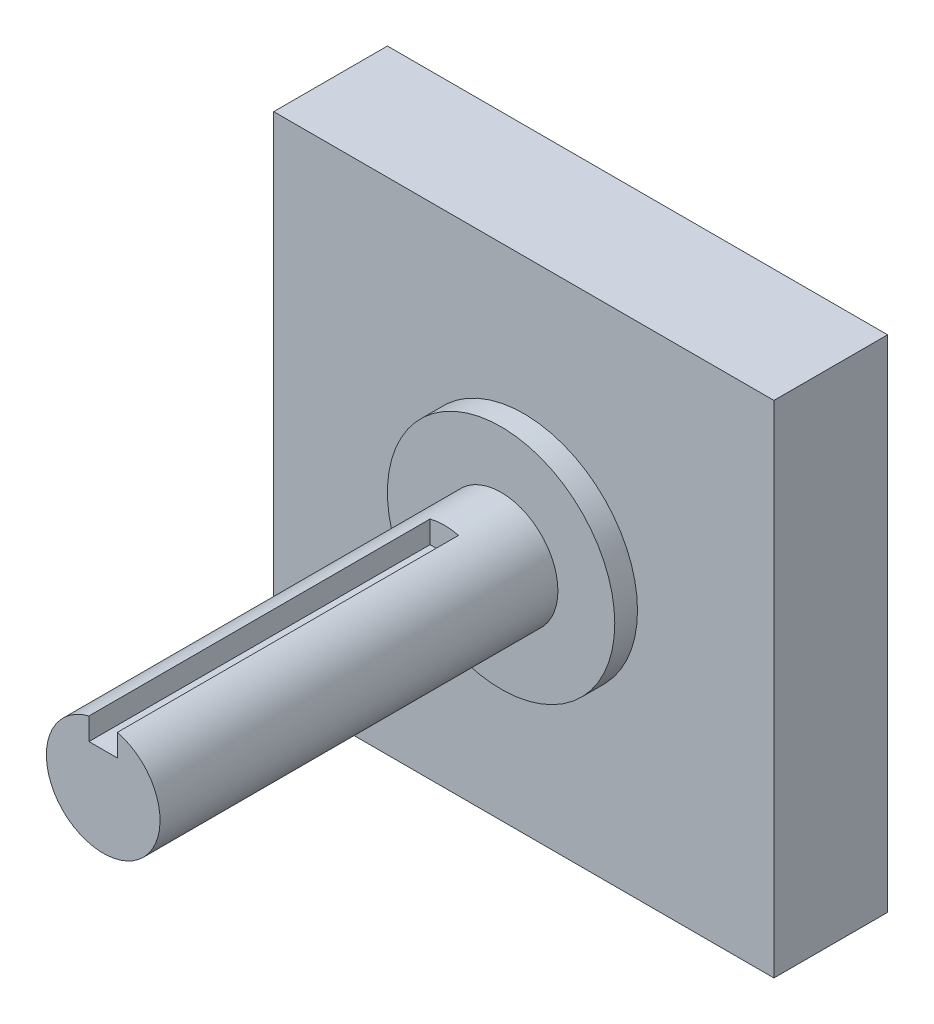
ISO-10303-21;
HEADER;
FILE_DESCRIPTION(('STEP AP214'),'2;1');
FILE_NAME('part.step','',(''),(''),'','','');
FILE_SCHEMA(('AUTOMOTIVE_DESIGN { 1 0 10303 214 1 1 1 1 }'));
ENDSEC;
DATA;
#1=APPLICATION_CONTEXT('core data for automotive mechanical design processes');
#2=APPLICATION_PROTOCOL_DEFINITION('international standard','automotive_design',2000,#1);
#3=PRODUCT_CONTEXT('',#1,'mechanical');
#4=PRODUCT('Part','Part','',(#3));
#5=PRODUCT_RELATED_PRODUCT_CATEGORY('part','',(#4));
#6=PRODUCT_DEFINITION_FORMATION('','',#4);
#7=PRODUCT_DEFINITION_CONTEXT('part definition',#1,'design');
#8=PRODUCT_DEFINITION('design','',#6,#7);
#9=PRODUCT_DEFINITION_SHAPE('','',#8);
#10=(LENGTH_UNIT() NAMED_UNIT(*) SI_UNIT(.MILLI.,.METRE.));
#11=(NAMED_UNIT(*) PLANE_ANGLE_UNIT() SI_UNIT($,.RADIAN.));
#12=(NAMED_UNIT(*) SI_UNIT($,.STERADIAN.) SOLID_ANGLE_UNIT());
#13=UNCERTAINTY_MEASURE_WITH_UNIT(LENGTH_MEASURE(1.E-05),#10,'distance_accuracy_value','');
#14=(GEOMETRIC_REPRESENTATION_CONTEXT(3) GLOBAL_UNCERTAINTY_ASSIGNED_CONTEXT((#13)) GLOBAL_UNIT_ASSIGNED_CONTEXT((#10,
#11,#12)) REPRESENTATION_CONTEXT('',''));
#15=CARTESIAN_POINT('',(0.,0.,0.));
#16=DIRECTION('',(0.,0.,1.));
#17=DIRECTION('',(1.,0.,0.));
#18=AXIS2_PLACEMENT_3D('',#15,#16,#17);
#19=CARTESIAN_POINT('',(22.,22.,10.));
#20=DIRECTION('',(-1.,0.,0.));
#21=DIRECTION('',(0.,-1.,0.));
#22=AXIS2_PLACEMENT_3D('',#19,#20,#21);
#23=PLANE('',#22);
#24=DIRECTION('',(0.,1.,0.));
#25=VECTOR('',#24,1.);
#26=CARTESIAN_POINT('',(22.,22.,0.));
#27=LINE('',#26,#25);
#28=CARTESIAN_POINT('',(22.,-22.,0.));
#29=VERTEX_POINT('',#28);
#30=CARTESIAN_POINT('',(22.,22.,0.));
#31=VERTEX_POINT('',#30);
#32=EDGE_CURVE('E193',#29,#31,#27,.T.);
#33=ORIENTED_EDGE('',*,*,#32,.T.);
#34=DIRECTION('',(0.,0.,-1.));
#35=VECTOR('',#34,1.);
#36=CARTESIAN_POINT('',(22.,22.,10.));
#37=LINE('',#36,#35);
#38=CARTESIAN_POINT('',(22.,22.,10.));
#39=VERTEX_POINT('',#38);
#40=EDGE_CURVE('E225',#39,#31,#37,.T.);
#41=ORIENTED_EDGE('',*,*,#40,.F.);
#42=DIRECTION('',(0.,1.,0.));
#43=VECTOR('',#42,1.);
#44=CARTESIAN_POINT('',(22.,22.,10.));
#45=LINE('',#44,#43);
#46=CARTESIAN_POINT('',(22.,-22.,10.));
#47=VERTEX_POINT('',#46);
#48=EDGE_CURVE('E194',#47,#39,#45,.T.);
#49=ORIENTED_EDGE('',*,*,#48,.F.);
#50=DIRECTION('',(0.,0.,-1.));
#51=VECTOR('',#50,1.);
#52=CARTESIAN_POINT('',(22.,-22.,10.));
#53=LINE('',#52,#51);
#54=EDGE_CURVE('E204',#47,#29,#53,.T.);
#55=ORIENTED_EDGE('',*,*,#54,.T.);
#56=EDGE_LOOP('',(#33,#41,#49,#55));
#57=FACE_BOUND('',#56,.T.);
#58=ADVANCED_FACE('F45',(#57),#23,.F.);
#59=CARTESIAN_POINT('',(-22.,22.,10.));
#60=DIRECTION('',(0.,-1.,0.));
#61=DIRECTION('',(0.,0.,-1.));
#62=AXIS2_PLACEMENT_3D('',#59,#60,#61);
#63=PLANE('',#62);
#64=DIRECTION('',(-1.,0.,0.));
#65=VECTOR('',#64,1.);
#66=CARTESIAN_POINT('',(-22.,22.,0.));
#67=LINE('',#66,#65);
#68=CARTESIAN_POINT('',(-22.,22.,0.));
#69=VERTEX_POINT('',#68);
#70=EDGE_CURVE('E208',#31,#69,#67,.T.);
#71=ORIENTED_EDGE('',*,*,#70,.T.);
#72=DIRECTION('',(0.,0.,-1.));
#73=VECTOR('',#72,1.);
#74=CARTESIAN_POINT('',(-22.,22.,10.));
#75=LINE('',#74,#73);
#76=CARTESIAN_POINT('',(-22.,22.,10.));
#77=VERTEX_POINT('',#76);
#78=EDGE_CURVE('E221',#77,#69,#75,.T.);
#79=ORIENTED_EDGE('',*,*,#78,.F.);
#80=DIRECTION('',(-1.,0.,0.));
#81=VECTOR('',#80,1.);
#82=CARTESIAN_POINT('',(-22.,22.,10.));
#83=LINE('',#82,#81);
#84=EDGE_CURVE('E98',#39,#77,#83,.T.);
#85=ORIENTED_EDGE('',*,*,#84,.F.);
#86=ORIENTED_EDGE('',*,*,#40,.T.);
#87=EDGE_LOOP('',(#71,#79,#85,#86));
#88=FACE_BOUND('',#87,.T.);
#89=ADVANCED_FACE('F253',(#88),#63,.F.);
#90=CARTESIAN_POINT('',(-22.,22.,10.));
#91=DIRECTION('',(1.,0.,0.));
#92=DIRECTION('',(0.,1.,0.));
#93=AXIS2_PLACEMENT_3D('',#90,#91,#92);
#94=PLANE('',#93);
#95=CARTESIAN_POINT('',(-22.,-11.,5.));
#96=DIRECTION('',(-1.,0.,0.));
#97=DIRECTION('',(0.,0.,1.));
#98=AXIS2_PLACEMENT_3D('',#95,#96,#97);
#99=CIRCLE('',#98,2.5);
#100=CARTESIAN_POINT('',(-22.,-11.,7.5));
#101=VERTEX_POINT('',#100);
#102=EDGE_CURVE('E170',#101,#101,#99,.T.);
#103=ORIENTED_EDGE('',*,*,#102,.F.);
#104=EDGE_LOOP('',(#103));
#105=FACE_BOUND('',#104,.T.);
#106=CARTESIAN_POINT('',(-22.,11.,5.));
#107=DIRECTION('',(-1.,0.,0.));
#108=DIRECTION('',(0.,0.,1.));
#109=AXIS2_PLACEMENT_3D('',#106,#107,#108);
#110=CIRCLE('',#109,2.5);
#111=CARTESIAN_POINT('',(-22.,11.,7.5));
#112=VERTEX_POINT('',#111);
#113=EDGE_CURVE('E174',#112,#112,#110,.T.);
#114=ORIENTED_EDGE('',*,*,#113,.F.);
#115=EDGE_LOOP('',(#114));
#116=FACE_BOUND('',#115,.T.);
#117=DIRECTION('',(0.,-1.,0.));
#118=VECTOR('',#117,1.);
#119=CARTESIAN_POINT('',(-22.,22.,0.));
#120=LINE('',#119,#118);
#121=CARTESIAN_POINT('',(-22.,-22.,0.));
#122=VERTEX_POINT('',#121);
#123=EDGE_CURVE('E211',#69,#122,#120,.T.);
#124=ORIENTED_EDGE('',*,*,#123,.T.);
#125=DIRECTION('',(0.,0.,-1.));
#126=VECTOR('',#125,1.);
#127=CARTESIAN_POINT('',(-22.,-22.,10.));
#128=LINE('',#127,#126);
#129=CARTESIAN_POINT('',(-22.,-22.,10.));
#130=VERTEX_POINT('',#129);
#131=EDGE_CURVE('E218',#130,#122,#128,.T.);
#132=ORIENTED_EDGE('',*,*,#131,.F.);
#133=DIRECTION('',(0.,-1.,0.));
#134=VECTOR('',#133,1.);
#135=CARTESIAN_POINT('',(-22.,22.,10.));
#136=LINE('',#135,#134);
#137=EDGE_CURVE('E199',#77,#130,#136,.T.);
#138=ORIENTED_EDGE('',*,*,#137,.F.);
#139=ORIENTED_EDGE('',*,*,#78,.T.);
#140=EDGE_LOOP('',(#124,#132,#138,#139));
#141=FACE_BOUND('',#140,.T.);
#142=ADVANCED_FACE('F258',(#105,#116,#141),#94,.F.);
#143=CARTESIAN_POINT('',(-22.,-22.,10.));
#144=DIRECTION('',(0.,1.,0.));
#145=DIRECTION('',(0.,0.,1.));
#146=AXIS2_PLACEMENT_3D('',#143,#144,#145);
#147=PLANE('',#146);
#148=DIRECTION('',(1.,0.,0.));
#149=VECTOR('',#148,1.);
#150=CARTESIAN_POINT('',(-22.,-22.,0.));
#151=LINE('',#150,#149);
#152=EDGE_CURVE('E90',#122,#29,#151,.T.);
#153=ORIENTED_EDGE('',*,*,#152,.T.);
#154=ORIENTED_EDGE('',*,*,#54,.F.);
#155=DIRECTION('',(1.,0.,0.));
#156=VECTOR('',#155,1.);
#157=CARTESIAN_POINT('',(-22.,-22.,10.));
#158=LINE('',#157,#156);
#159=EDGE_CURVE('E69',#130,#47,#158,.T.);
#160=ORIENTED_EDGE('',*,*,#159,.F.);
#161=ORIENTED_EDGE('',*,*,#131,.T.);
#162=EDGE_LOOP('',(#153,#154,#160,#161));
#163=FACE_BOUND('',#162,.T.);
#164=ADVANCED_FACE('F270',(#163),#147,.F.);
#165=CARTESIAN_POINT('',(0.,0.,10.));
#166=DIRECTION('',(0.,0.,1.));
#167=DIRECTION('',(1.,0.,0.));
#168=AXIS2_PLACEMENT_3D('',#165,#166,#167);
#169=PLANE('',#168);
#170=CARTESIAN_POINT('',(0.,0.,10.));
#171=DIRECTION('',(0.,0.,1.));
#172=DIRECTION('',(1.,0.,0.));
#173=AXIS2_PLACEMENT_3D('',#170,#171,#172);
#174=CIRCLE('',#173,10.);
#175=CARTESIAN_POINT('',(10.,0.,10.));
#176=VERTEX_POINT('',#175);
#177=EDGE_CURVE('E155',#176,#176,#174,.T.);
#178=ORIENTED_EDGE('',*,*,#177,.F.);
#179=EDGE_LOOP('',(#178));
#180=FACE_BOUND('',#179,.T.);
#181=ORIENTED_EDGE('',*,*,#48,.T.);
#182=ORIENTED_EDGE('',*,*,#84,.T.);
#183=ORIENTED_EDGE('',*,*,#137,.T.);
#184=ORIENTED_EDGE('',*,*,#159,.T.);
#185=EDGE_LOOP('',(#181,#182,#183,#184));
#186=FACE_BOUND('',#185,.T.);
#187=ADVANCED_FACE('F268',(#180,#186),#169,.T.);
#188=CARTESIAN_POINT('',(0.,0.,0.));
#189=DIRECTION('',(0.,0.,1.));
#190=DIRECTION('',(1.,0.,0.));
#191=AXIS2_PLACEMENT_3D('',#188,#189,#190);
#192=PLANE('',#191);
#193=CARTESIAN_POINT('',(0.,0.,0.));
#194=DIRECTION('',(0.,0.,-1.));
#195=DIRECTION('',(-1.,0.,0.));
#196=AXIS2_PLACEMENT_3D('',#193,#194,#195);
#197=CIRCLE('',#196,5.);
#198=CARTESIAN_POINT('',(-5.,0.,0.));
#199=VERTEX_POINT('',#198);
#200=EDGE_CURVE('E169',#199,#199,#197,.T.);
#201=ORIENTED_EDGE('',*,*,#200,.F.);
#202=EDGE_LOOP('',(#201));
#203=FACE_BOUND('',#202,.T.);
#204=ORIENTED_EDGE('',*,*,#32,.F.);
#205=ORIENTED_EDGE('',*,*,#152,.F.);
#206=ORIENTED_EDGE('',*,*,#123,.F.);
#207=ORIENTED_EDGE('',*,*,#70,.F.);
#208=EDGE_LOOP('',(#204,#205,#206,#207));
#209=FACE_BOUND('',#208,.T.);
#210=ADVANCED_FACE('F263',(#203,#209),#192,.F.);
#211=CARTESIAN_POINT('',(0.,0.,3.));
#212=DIRECTION('',(0.,0.,-1.));
#213=DIRECTION('',(-1.,0.,0.));
#214=AXIS2_PLACEMENT_3D('',#211,#212,#213);
#215=CYLINDRICAL_SURFACE('',#214,5.);
#216=CARTESIAN_POINT('',(0.,0.,3.));
#217=DIRECTION('',(0.,0.,-1.));
#218=DIRECTION('',(-1.,0.,0.));
#219=AXIS2_PLACEMENT_3D('',#216,#217,#218);
#220=CIRCLE('',#219,5.);
#221=CARTESIAN_POINT('',(-5.,0.,3.));
#222=VERTEX_POINT('',#221);
#223=EDGE_CURVE('E182',#222,#222,#220,.T.);
#224=ORIENTED_EDGE('',*,*,#223,.F.);
#225=EDGE_LOOP('',(#224));
#226=FACE_BOUND('',#225,.T.);
#227=ORIENTED_EDGE('',*,*,#200,.T.);
#228=EDGE_LOOP('',(#227));
#229=FACE_BOUND('',#228,.T.);
#230=ADVANCED_FACE('F278',(#226,#229),#215,.F.);
#231=CARTESIAN_POINT('',(0.,0.,3.));
#232=DIRECTION('',(0.,0.,-1.));
#233=DIRECTION('',(-1.,0.,0.));
#234=AXIS2_PLACEMENT_3D('',#231,#232,#233);
#235=PLANE('',#234);
#236=ORIENTED_EDGE('',*,*,#223,.T.);
#237=EDGE_LOOP('',(#236));
#238=FACE_BOUND('',#237,.T.);
#239=ADVANCED_FACE('F299',(#238),#235,.T.);
#240=CARTESIAN_POINT('',(19.,11.,5.));
#241=DIRECTION('',(-1.,0.,0.));
#242=DIRECTION('',(0.,0.,1.));
#243=AXIS2_PLACEMENT_3D('',#240,#241,#242);
#244=CYLINDRICAL_SURFACE('',#243,2.5);
#245=CARTESIAN_POINT('',(19.,11.,5.));
#246=DIRECTION('',(-1.,0.,0.));
#247=DIRECTION('',(0.,0.,1.));
#248=AXIS2_PLACEMENT_3D('',#245,#246,#247);
#249=CIRCLE('',#248,2.5);
#250=CARTESIAN_POINT('',(19.,11.,7.5));
#251=VERTEX_POINT('',#250);
#252=EDGE_CURVE('E178',#251,#251,#249,.T.);
#253=CARTESIAN_POINT('',(19.,11.,7.5));
#254=CARTESIAN_POINT('',(18.5729166666667,11.,7.5));
#255=CARTESIAN_POINT('',(18.1458333333333,11.,7.5));
#256=CARTESIAN_POINT('',(17.2916666666667,11.,7.5));
#257=CARTESIAN_POINT('',(16.8645833333333,11.,7.5));
#258=CARTESIAN_POINT('',(16.0104166666667,11.,7.5));
#259=CARTESIAN_POINT('',(15.5833333333333,11.,7.5));
#260=CARTESIAN_POINT('',(14.7291666666667,11.,7.5));
#261=CARTESIAN_POINT('',(14.3020833333333,11.,7.5));
#262=CARTESIAN_POINT('',(13.4479166666667,11.,7.5));
#263=CARTESIAN_POINT('',(13.0208333333333,11.,7.5));
#264=CARTESIAN_POINT('',(12.1666666666667,11.,7.5));
#265=CARTESIAN_POINT('',(11.7395833333333,11.,7.5));
#266=CARTESIAN_POINT('',(10.8854166666667,11.,7.5));
#267=CARTESIAN_POINT('',(10.4583333333333,11.,7.5));
#268=CARTESIAN_POINT('',(9.60416666666667,11.,7.5));
#269=CARTESIAN_POINT('',(9.17708333333334,11.,7.5));
#270=CARTESIAN_POINT('',(8.32291666666667,11.,7.5));
#271=CARTESIAN_POINT('',(7.89583333333334,11.,7.5));
#272=CARTESIAN_POINT('',(7.04166666666667,11.,7.5));
#273=CARTESIAN_POINT('',(6.61458333333334,11.,7.5));
#274=CARTESIAN_POINT('',(5.76041666666667,11.,7.5));
#275=CARTESIAN_POINT('',(5.33333333333334,11.,7.5));
#276=CARTESIAN_POINT('',(4.47916666666667,11.,7.5));
#277=CARTESIAN_POINT('',(4.05208333333334,11.,7.5));
#278=CARTESIAN_POINT('',(3.19791666666667,11.,7.5));
#279=CARTESIAN_POINT('',(2.77083333333334,11.,7.5));
#280=CARTESIAN_POINT('',(1.91666666666668,11.,7.5));
#281=CARTESIAN_POINT('',(1.48958333333334,11.,7.5));
#282=CARTESIAN_POINT('',(0.635416666666678,11.,7.5));
#283=CARTESIAN_POINT('',(0.208333333333344,11.,7.5));
#284=CARTESIAN_POINT('',(-0.645833333333324,11.,7.5));
#285=CARTESIAN_POINT('',(-1.07291666666666,11.,7.5));
#286=CARTESIAN_POINT('',(-1.92708333333332,11.,7.5));
#287=CARTESIAN_POINT('',(-2.35416666666666,11.,7.5));
#288=CARTESIAN_POINT('',(-3.20833333333333,11.,7.5));
#289=CARTESIAN_POINT('',(-3.63541666666666,11.,7.5));
#290=CARTESIAN_POINT('',(-4.48958333333333,11.,7.5));
#291=CARTESIAN_POINT('',(-4.91666666666666,11.,7.5));
#292=CARTESIAN_POINT('',(-5.77083333333333,11.,7.5));
#293=CARTESIAN_POINT('',(-6.19791666666666,11.,7.5));
#294=CARTESIAN_POINT('',(-7.05208333333333,11.,7.5));
#295=CARTESIAN_POINT('',(-7.47916666666666,11.,7.5));
#296=CARTESIAN_POINT('',(-8.33333333333333,11.,7.5));
#297=CARTESIAN_POINT('',(-8.76041666666666,11.,7.5));
#298=CARTESIAN_POINT('',(-9.61458333333332,11.,7.5));
#299=CARTESIAN_POINT('',(-10.0416666666667,11.,7.5));
#300=CARTESIAN_POINT('',(-10.8958333333333,11.,7.5));
#301=CARTESIAN_POINT('',(-11.3229166666667,11.,7.5));
#302=CARTESIAN_POINT('',(-12.1770833333333,11.,7.5));
#303=CARTESIAN_POINT('',(-12.6041666666667,11.,7.5));
#304=CARTESIAN_POINT('',(-13.4583333333333,11.,7.5));
#305=CARTESIAN_POINT('',(-13.8854166666667,11.,7.5));
#306=CARTESIAN_POINT('',(-14.7395833333333,11.,7.5));
#307=CARTESIAN_POINT('',(-15.1666666666667,11.,7.5));
#308=CARTESIAN_POINT('',(-16.0208333333333,11.,7.5));
#309=CARTESIAN_POINT('',(-16.4479166666667,11.,7.5));
#310=CARTESIAN_POINT('',(-17.3020833333333,11.,7.5));
#311=CARTESIAN_POINT('',(-17.7291666666667,11.,7.5));
#312=CARTESIAN_POINT('',(-18.5833333333333,11.,7.5));
#313=CARTESIAN_POINT('',(-19.0104166666667,11.,7.5));
#314=CARTESIAN_POINT('',(-19.8645833333333,11.,7.5));
#315=CARTESIAN_POINT('',(-20.2916666666667,11.,7.5));
#316=CARTESIAN_POINT('',(-21.1458333333333,11.,7.5));
#317=CARTESIAN_POINT('',(-21.5729166666667,11.,7.5));
#318=CARTESIAN_POINT('',(-22.,11.,7.5));
#319=B_SPLINE_CURVE_WITH_KNOTS('',3,(#253,#254,#255,#256,#257,#258,#259,#260,#261,#262,#263,
#264,#265,#266,#267,#268,#269,#270,#271,#272,#273,#274,#275,#276,#277,#278,#279,#280,#281,#282,
#283,#284,#285,#286,#287,#288,#289,#290,#291,#292,#293,#294,#295,#296,#297,#298,#299,#300,#301,
#302,#303,#304,#305,#306,#307,#308,#309,#310,#311,#312,#313,#314,#315,#316,#317,#318),
.UNSPECIFIED.,.F.,.F.,(4,2,2,2,2,2,2,2,2,2,2,2,2,2,2,2,2,2,2,2,2,2,2,2,2,2,2,2,2,2,2,2,4),(0.,
1.28125,2.5625,3.84375,5.125,6.40625,7.6875,8.96875,10.25,11.53125,12.8125,14.09375,15.375,
16.65625,17.9375,19.21875,20.5,21.78125,23.0625,24.34375,25.625,26.90625,28.1875,29.46875,30.75,
32.03125,33.3125,34.59375,35.875,37.15625,38.4375,39.71875,41.),.UNSPECIFIED.);
#320=EDGE_CURVE('BSEAM297',#251,#112,#319,.T.);
#321=ORIENTED_EDGE('',*,*,#252,.F.);
#322=ORIENTED_EDGE('',*,*,#113,.T.);
#323=ORIENTED_EDGE('',*,*,#320,.T.);
#324=ORIENTED_EDGE('',*,*,#320,.F.);
#325=EDGE_LOOP('',(#321,#323,#322,#324));
#326=FACE_BOUND('',#325,.T.);
#327=ADVANCED_FACE('F297',(#326),#244,.F.);
#328=CARTESIAN_POINT('',(19.,11.,5.));
#329=DIRECTION('',(-1.,0.,0.));
#330=DIRECTION('',(0.,0.,1.));
#331=AXIS2_PLACEMENT_3D('',#328,#329,#330);
#332=PLANE('',#331);
#333=ORIENTED_EDGE('',*,*,#252,.T.);
#334=EDGE_LOOP('',(#333));
#335=FACE_BOUND('',#334,.T.);
#336=ADVANCED_FACE('F298',(#335),#332,.T.);
#337=CARTESIAN_POINT('',(19.,-11.,5.));
#338=DIRECTION('',(-1.,0.,0.));
#339=DIRECTION('',(0.,0.,1.));
#340=AXIS2_PLACEMENT_3D('',#337,#338,#339);
#341=CYLINDRICAL_SURFACE('',#340,2.5);
#342=CARTESIAN_POINT('',(19.,-11.,5.));
#343=DIRECTION('',(-1.,0.,0.));
#344=DIRECTION('',(0.,0.,1.));
#345=AXIS2_PLACEMENT_3D('',#342,#343,#344);
#346=CIRCLE('',#345,2.5);
#347=CARTESIAN_POINT('',(19.,-11.,7.5));
#348=VERTEX_POINT('',#347);
#349=EDGE_CURVE('E165',#348,#348,#346,.T.);
#350=CARTESIAN_POINT('',(19.,-11.,7.5));
#351=CARTESIAN_POINT('',(18.5729166666667,-11.,7.5));
#352=CARTESIAN_POINT('',(18.1458333333333,-11.,7.5));
#353=CARTESIAN_POINT('',(17.2916666666667,-11.,7.5));
#354=CARTESIAN_POINT('',(16.8645833333333,-11.,7.5));
#355=CARTESIAN_POINT('',(16.0104166666667,-11.,7.5));
#356=CARTESIAN_POINT('',(15.5833333333333,-11.,7.5));
#357=CARTESIAN_POINT('',(14.7291666666667,-11.,7.5));
#358=CARTESIAN_POINT('',(14.3020833333333,-11.,7.5));
#359=CARTESIAN_POINT('',(13.4479166666667,-11.,7.5));
#360=CARTESIAN_POINT('',(13.0208333333333,-11.,7.5));
#361=CARTESIAN_POINT('',(12.1666666666667,-11.,7.5));
#362=CARTESIAN_POINT('',(11.7395833333333,-11.,7.5));
#363=CARTESIAN_POINT('',(10.8854166666667,-11.,7.5));
#364=CARTESIAN_POINT('',(10.4583333333333,-11.,7.5));
#365=CARTESIAN_POINT('',(9.60416666666667,-11.,7.5));
#366=CARTESIAN_POINT('',(9.17708333333334,-11.,7.5));
#367=CARTESIAN_POINT('',(8.32291666666667,-11.,7.5));
#368=CARTESIAN_POINT('',(7.89583333333334,-11.,7.5));
#369=CARTESIAN_POINT('',(7.04166666666667,-11.,7.5));
#370=CARTESIAN_POINT('',(6.61458333333334,-11.,7.5));
#371=CARTESIAN_POINT('',(5.76041666666667,-11.,7.5));
#372=CARTESIAN_POINT('',(5.33333333333334,-11.,7.5));
#373=CARTESIAN_POINT('',(4.47916666666667,-11.,7.5));
#374=CARTESIAN_POINT('',(4.05208333333334,-11.,7.5));
#375=CARTESIAN_POINT('',(3.19791666666667,-11.,7.5));
#376=CARTESIAN_POINT('',(2.77083333333334,-11.,7.5));
#377=CARTESIAN_POINT('',(1.91666666666668,-11.,7.5));
#378=CARTESIAN_POINT('',(1.48958333333334,-11.,7.5));
#379=CARTESIAN_POINT('',(0.635416666666678,-11.,7.5));
#380=CARTESIAN_POINT('',(0.208333333333344,-11.,7.5));
#381=CARTESIAN_POINT('',(-0.645833333333324,-11.,7.5));
#382=CARTESIAN_POINT('',(-1.07291666666666,-11.,7.5));
#383=CARTESIAN_POINT('',(-1.92708333333332,-11.,7.5));
#384=CARTESIAN_POINT('',(-2.35416666666666,-11.,7.5));
#385=CARTESIAN_POINT('',(-3.20833333333333,-11.,7.5));
#386=CARTESIAN_POINT('',(-3.63541666666666,-11.,7.5));
#387=CARTESIAN_POINT('',(-4.48958333333333,-11.,7.5));
#388=CARTESIAN_POINT('',(-4.91666666666666,-11.,7.5));
#389=CARTESIAN_POINT('',(-5.77083333333333,-11.,7.5));
#390=CARTESIAN_POINT('',(-6.19791666666666,-11.,7.5));
#391=CARTESIAN_POINT('',(-7.05208333333333,-11.,7.5));
#392=CARTESIAN_POINT('',(-7.47916666666666,-11.,7.5));
#393=CARTESIAN_POINT('',(-8.33333333333333,-11.,7.5));
#394=CARTESIAN_POINT('',(-8.76041666666666,-11.,7.5));
#395=CARTESIAN_POINT('',(-9.61458333333332,-11.,7.5));
#396=CARTESIAN_POINT('',(-10.0416666666667,-11.,7.5));
#397=CARTESIAN_POINT('',(-10.8958333333333,-11.,7.5));
#398=CARTESIAN_POINT('',(-11.3229166666667,-11.,7.5));
#399=CARTESIAN_POINT('',(-12.1770833333333,-11.,7.5));
#400=CARTESIAN_POINT('',(-12.6041666666667,-11.,7.5));
#401=CARTESIAN_POINT('',(-13.4583333333333,-11.,7.5));
#402=CARTESIAN_POINT('',(-13.8854166666667,-11.,7.5));
#403=CARTESIAN_POINT('',(-14.7395833333333,-11.,7.5));
#404=CARTESIAN_POINT('',(-15.1666666666667,-11.,7.5));
#405=CARTESIAN_POINT('',(-16.0208333333333,-11.,7.5));
#406=CARTESIAN_POINT('',(-16.4479166666667,-11.,7.5));
#407=CARTESIAN_POINT('',(-17.3020833333333,-11.,7.5));
#408=CARTESIAN_POINT('',(-17.7291666666667,-11.,7.5));
#409=CARTESIAN_POINT('',(-18.5833333333333,-11.,7.5));
#410=CARTESIAN_POINT('',(-19.0104166666667,-11.,7.5));
#411=CARTESIAN_POINT('',(-19.8645833333333,-11.,7.5));
#412=CARTESIAN_POINT('',(-20.2916666666667,-11.,7.5));
#413=CARTESIAN_POINT('',(-21.1458333333333,-11.,7.5));
#414=CARTESIAN_POINT('',(-21.5729166666667,-11.,7.5));
#415=CARTESIAN_POINT('',(-22.,-11.,7.5));
#416=B_SPLINE_CURVE_WITH_KNOTS('',3,(#350,#351,#352,#353,#354,#355,#356,#357,#358,#359,#360,
#361,#362,#363,#364,#365,#366,#367,#368,#369,#370,#371,#372,#373,#374,#375,#376,#377,#378,#379,
#380,#381,#382,#383,#384,#385,#386,#387,#388,#389,#390,#391,#392,#393,#394,#395,#396,#397,#398,
#399,#400,#401,#402,#403,#404,#405,#406,#407,#408,#409,#410,#411,#412,#413,#414,#415),
.UNSPECIFIED.,.F.,.F.,(4,2,2,2,2,2,2,2,2,2,2,2,2,2,2,2,2,2,2,2,2,2,2,2,2,2,2,2,2,2,2,2,4),(0.,
1.28125,2.5625,3.84375,5.125,6.40625,7.6875,8.96875,10.25,11.53125,12.8125,14.09375,15.375,
16.65625,17.9375,19.21875,20.5,21.78125,23.0625,24.34375,25.625,26.90625,28.1875,29.46875,30.75,
32.03125,33.3125,34.59375,35.875,37.15625,38.4375,39.71875,41.),.UNSPECIFIED.);
#417=EDGE_CURVE('BSEAM305',#348,#101,#416,.T.);
#418=ORIENTED_EDGE('',*,*,#349,.F.);
#419=ORIENTED_EDGE('',*,*,#102,.T.);
#420=ORIENTED_EDGE('',*,*,#417,.T.);
#421=ORIENTED_EDGE('',*,*,#417,.F.);
#422=EDGE_LOOP('',(#418,#420,#419,#421));
#423=FACE_BOUND('',#422,.T.);
#424=ADVANCED_FACE('F305',(#423),#341,.F.);
#425=CARTESIAN_POINT('',(19.,-11.,5.));
#426=DIRECTION('',(-1.,0.,0.));
#427=DIRECTION('',(0.,0.,1.));
#428=AXIS2_PLACEMENT_3D('',#425,#426,#427);
#429=PLANE('',#428);
#430=ORIENTED_EDGE('',*,*,#349,.T.);
#431=EDGE_LOOP('',(#430));
#432=FACE_BOUND('',#431,.T.);
#433=ADVANCED_FACE('F327',(#432),#429,.T.);
#434=CARTESIAN_POINT('',(0.,0.,12.));
#435=DIRECTION('',(0.,0.,-1.));
#436=DIRECTION('',(-1.,0.,0.));
#437=AXIS2_PLACEMENT_3D('',#434,#435,#436);
#438=CYLINDRICAL_SURFACE('',#437,10.);
#439=CARTESIAN_POINT('',(0.,0.,12.));
#440=DIRECTION('',(0.,0.,1.));
#441=DIRECTION('',(1.,0.,0.));
#442=AXIS2_PLACEMENT_3D('',#439,#440,#441);
#443=CIRCLE('',#442,10.);
#444=CARTESIAN_POINT('',(10.,0.,12.));
#445=VERTEX_POINT('',#444);
#446=EDGE_CURVE('E157',#445,#445,#443,.T.);
#447=ORIENTED_EDGE('',*,*,#446,.F.);
#448=EDGE_LOOP('',(#447));
#449=FACE_BOUND('',#448,.T.);
#450=ORIENTED_EDGE('',*,*,#177,.T.);
#451=EDGE_LOOP('',(#450));
#452=FACE_BOUND('',#451,.T.);
#453=ADVANCED_FACE('F322',(#449,#452),#438,.T.);
#454=CARTESIAN_POINT('',(0.,0.,12.));
#455=DIRECTION('',(0.,0.,1.));
#456=DIRECTION('',(1.,0.,0.));
#457=AXIS2_PLACEMENT_3D('',#454,#455,#456);
#458=PLANE('',#457);
#459=CARTESIAN_POINT('',(0.,0.,12.));
#460=DIRECTION('',(0.,0.,1.));
#461=DIRECTION('',(1.,0.,0.));
#462=AXIS2_PLACEMENT_3D('',#459,#460,#461);
#463=CIRCLE('',#462,5.);
#464=CARTESIAN_POINT('',(5.,0.,12.));
#465=VERTEX_POINT('',#464);
#466=EDGE_CURVE('E161',#465,#465,#463,.T.);
#467=ORIENTED_EDGE('',*,*,#466,.F.);
#468=EDGE_LOOP('',(#467));
#469=FACE_BOUND('',#468,.T.);
#470=ORIENTED_EDGE('',*,*,#446,.T.);
#471=EDGE_LOOP('',(#470));
#472=FACE_BOUND('',#471,.T.);
#473=ADVANCED_FACE('F317',(#469,#472),#458,.T.);
#474=CARTESIAN_POINT('',(0.,0.,47.));
#475=DIRECTION('',(0.,0.,1.));
#476=DIRECTION('',(1.,0.,0.));
#477=AXIS2_PLACEMENT_3D('',#474,#475,#476);
#478=PLANE('',#477);
#479=DIRECTION('',(0.,-1.,0.));
#480=VECTOR('',#479,1.);
#481=CARTESIAN_POINT('',(-1.25,5.88524590163948,47.));
#482=LINE('',#481,#480);
#483=CARTESIAN_POINT('',(-1.25,4.84122918275927,47.));
#484=VERTEX_POINT('',#483);
#485=CARTESIAN_POINT('',(-1.25,2.88524590163948,47.));
#486=VERTEX_POINT('',#485);
#487=EDGE_CURVE('E134',#484,#486,#482,.T.);
#488=ORIENTED_EDGE('',*,*,#487,.F.);
#489=CARTESIAN_POINT('',(0.,0.,47.));
#490=DIRECTION('',(0.,0.,1.));
#491=DIRECTION('',(1.,0.,0.));
#492=AXIS2_PLACEMENT_3D('',#489,#490,#491);
#493=CIRCLE('',#492,5.);
#494=CARTESIAN_POINT('',(1.25,4.84122918275927,47.));
#495=VERTEX_POINT('',#494);
#496=EDGE_CURVE('E186',#484,#495,#493,.T.);
#497=ORIENTED_EDGE('',*,*,#496,.T.);
#498=DIRECTION('',(0.,1.,0.));
#499=VECTOR('',#498,1.);
#500=CARTESIAN_POINT('',(1.25,5.88524590163948,47.));
#501=LINE('',#500,#499);
#502=CARTESIAN_POINT('',(1.25,2.88524590163948,47.));
#503=VERTEX_POINT('',#502);
#504=EDGE_CURVE('E128',#503,#495,#501,.T.);
#505=ORIENTED_EDGE('',*,*,#504,.F.);
#506=DIRECTION('',(1.,0.,0.));
#507=VECTOR('',#506,1.);
#508=CARTESIAN_POINT('',(-1.25,2.88524590163948,47.));
#509=LINE('',#508,#507);
#510=EDGE_CURVE('E149',#486,#503,#509,.T.);
#511=ORIENTED_EDGE('',*,*,#510,.F.);
#512=EDGE_LOOP('',(#488,#497,#505,#511));
#513=FACE_BOUND('',#512,.T.);
#514=ADVANCED_FACE('F241',(#513),#478,.T.);
#515=CARTESIAN_POINT('',(0.,0.,47.));
#516=DIRECTION('',(0.,0.,-1.));
#517=DIRECTION('',(-1.,0.,0.));
#518=AXIS2_PLACEMENT_3D('',#515,#516,#517);
#519=CYLINDRICAL_SURFACE('',#518,5.);
#520=ORIENTED_EDGE('',*,*,#496,.F.);
#521=DIRECTION('',(0.,0.,-1.));
#522=VECTOR('',#521,1.);
#523=CARTESIAN_POINT('',(-1.25,4.84122918275927,47.));
#524=LINE('',#523,#522);
#525=CARTESIAN_POINT('',(-1.25,4.84122918275927,17.));
#526=VERTEX_POINT('',#525);
#527=EDGE_CURVE('E11',#484,#526,#524,.T.);
#528=ORIENTED_EDGE('',*,*,#527,.T.);
#529=CARTESIAN_POINT('',(0.,0.,17.));
#530=DIRECTION('',(0.,0.,1.));
#531=DIRECTION('',(1.,0.,0.));
#532=AXIS2_PLACEMENT_3D('',#529,#530,#531);
#533=CIRCLE('',#532,5.);
#534=CARTESIAN_POINT('',(1.25,4.84122918275927,17.));
#535=VERTEX_POINT('',#534);
#536=EDGE_CURVE('E125',#535,#526,#533,.T.);
#537=ORIENTED_EDGE('',*,*,#536,.F.);
#538=DIRECTION('',(0.,0.,-1.));
#539=VECTOR('',#538,1.);
#540=CARTESIAN_POINT('',(1.25,4.84122918275927,47.));
#541=LINE('',#540,#539);
#542=EDGE_CURVE('E53',#535,#495,#541,.F.);
#543=ORIENTED_EDGE('',*,*,#542,.T.);
#544=EDGE_LOOP('',(#520,#528,#537,#543));
#545=FACE_BOUND('',#544,.T.);
#546=ORIENTED_EDGE('',*,*,#466,.T.);
#547=EDGE_LOOP('',(#546));
#548=FACE_BOUND('',#547,.T.);
#549=ADVANCED_FACE('F236',(#545,#548),#519,.T.);
#550=CARTESIAN_POINT('',(-1.25,5.88524590163948,17.));
#551=DIRECTION('',(-1.,0.,0.));
#552=DIRECTION('',(0.,0.,1.));
#553=AXIS2_PLACEMENT_3D('',#550,#551,#552);
#554=PLANE('',#553);
#555=ORIENTED_EDGE('',*,*,#487,.T.);
#556=DIRECTION('',(0.,0.,1.));
#557=VECTOR('',#556,1.);
#558=CARTESIAN_POINT('',(-1.25,2.88524590163948,17.));
#559=LINE('',#558,#557);
#560=CARTESIAN_POINT('',(-1.25,2.88524590163948,17.));
#561=VERTEX_POINT('',#560);
#562=EDGE_CURVE('E131',#561,#486,#559,.T.);
#563=ORIENTED_EDGE('',*,*,#562,.F.);
#564=DIRECTION('',(0.,-1.,0.));
#565=VECTOR('',#564,1.);
#566=CARTESIAN_POINT('',(-1.25,5.88524590163948,17.));
#567=LINE('',#566,#565);
#568=EDGE_CURVE('E119',#526,#561,#567,.T.);
#569=ORIENTED_EDGE('',*,*,#568,.F.);
#570=ORIENTED_EDGE('',*,*,#527,.F.);
#571=EDGE_LOOP('',(#555,#563,#569,#570));
#572=FACE_BOUND('',#571,.T.);
#573=ADVANCED_FACE('F132',(#572),#554,.F.);
#574=CARTESIAN_POINT('',(1.25,5.88524590163948,17.));
#575=DIRECTION('',(1.,0.,0.));
#576=DIRECTION('',(0.,0.,-1.));
#577=AXIS2_PLACEMENT_3D('',#574,#575,#576);
#578=PLANE('',#577);
#579=DIRECTION('',(0.,1.,0.));
#580=VECTOR('',#579,1.);
#581=CARTESIAN_POINT('',(1.25,5.88524590163948,17.));
#582=LINE('',#581,#580);
#583=CARTESIAN_POINT('',(1.25,2.88524590163948,17.));
#584=VERTEX_POINT('',#583);
#585=EDGE_CURVE('E60',#584,#535,#582,.T.);
#586=ORIENTED_EDGE('',*,*,#585,.F.);
#587=DIRECTION('',(0.,0.,1.));
#588=VECTOR('',#587,1.);
#589=CARTESIAN_POINT('',(1.25,2.88524590163948,17.));
#590=LINE('',#589,#588);
#591=EDGE_CURVE('E139',#584,#503,#590,.T.);
#592=ORIENTED_EDGE('',*,*,#591,.T.);
#593=ORIENTED_EDGE('',*,*,#504,.T.);
#594=ORIENTED_EDGE('',*,*,#542,.F.);
#595=EDGE_LOOP('',(#586,#592,#593,#594));
#596=FACE_BOUND('',#595,.T.);
#597=ADVANCED_FACE('F242',(#596),#578,.F.);
#598=CARTESIAN_POINT('',(0.,0.,17.));
#599=DIRECTION('',(0.,0.,1.));
#600=DIRECTION('',(1.,0.,0.));
#601=AXIS2_PLACEMENT_3D('',#598,#599,#600);
#602=PLANE('',#601);
#603=ORIENTED_EDGE('',*,*,#536,.T.);
#604=ORIENTED_EDGE('',*,*,#568,.T.);
#605=DIRECTION('',(1.,0.,0.));
#606=VECTOR('',#605,1.);
#607=CARTESIAN_POINT('',(-1.25,2.88524590163948,17.));
#608=LINE('',#607,#606);
#609=EDGE_CURVE('E123',#561,#584,#608,.T.);
#610=ORIENTED_EDGE('',*,*,#609,.T.);
#611=ORIENTED_EDGE('',*,*,#585,.T.);
#612=EDGE_LOOP('',(#603,#604,#610,#611));
#613=FACE_BOUND('',#612,.T.);
#614=ADVANCED_FACE('F121',(#613),#602,.T.);
#615=CARTESIAN_POINT('',(-1.25,2.88524590163948,17.));
#616=DIRECTION('',(0.,-1.,0.));
#617=DIRECTION('',(0.,0.,-1.));
#618=AXIS2_PLACEMENT_3D('',#615,#616,#617);
#619=PLANE('',#618);
#620=ORIENTED_EDGE('',*,*,#510,.T.);
#621=ORIENTED_EDGE('',*,*,#591,.F.);
#622=ORIENTED_EDGE('',*,*,#609,.F.);
#623=ORIENTED_EDGE('',*,*,#562,.T.);
#624=EDGE_LOOP('',(#620,#621,#622,#623));
#625=FACE_BOUND('',#624,.T.);
#626=ADVANCED_FACE('F141',(#625),#619,.F.);
#627=CLOSED_SHELL('',(#58,#89,#142,#164,#187,#210,#230,#239,#327,#336,#424,#433,#453,#473,#514,
#549,#573,#597,#614,#626));
#628=MANIFOLD_SOLID_BREP('B2',#627);
#629=ADVANCED_BREP_SHAPE_REPRESENTATION('',(#18,#628),#14);
#630=SHAPE_DEFINITION_REPRESENTATION(#9,#629);
ENDSEC;
END-ISO-10303-21;
